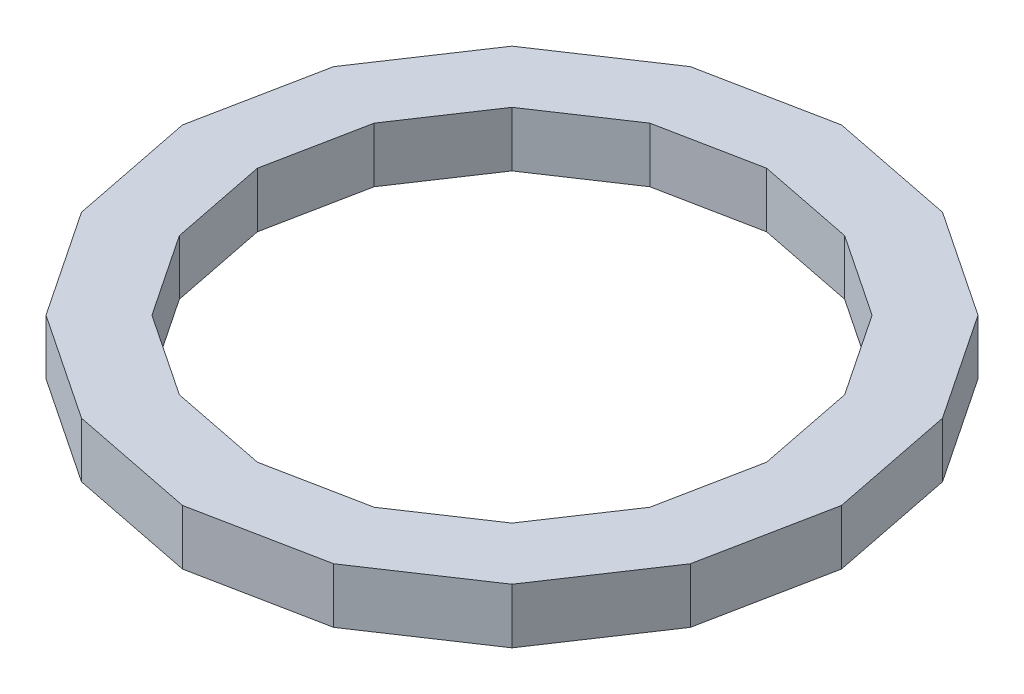
ISO-10303-21;
HEADER;
FILE_DESCRIPTION(('STEP AP214'),'2;1');
FILE_NAME('part.step','',(''),(''),'','','');
FILE_SCHEMA(('AUTOMOTIVE_DESIGN { 1 0 10303 214 1 1 1 1 }'));
ENDSEC;
DATA;
#1=APPLICATION_CONTEXT('core data for automotive mechanical design processes');
#2=APPLICATION_PROTOCOL_DEFINITION('international standard','automotive_design',2000,#1);
#3=PRODUCT_CONTEXT('',#1,'mechanical');
#4=PRODUCT('Part','Part','',(#3));
#5=PRODUCT_RELATED_PRODUCT_CATEGORY('part','',(#4));
#6=PRODUCT_DEFINITION_FORMATION('','',#4);
#7=PRODUCT_DEFINITION_CONTEXT('part definition',#1,'design');
#8=PRODUCT_DEFINITION('design','',#6,#7);
#9=PRODUCT_DEFINITION_SHAPE('','',#8);
#10=(LENGTH_UNIT() NAMED_UNIT(*) SI_UNIT(.MILLI.,.METRE.));
#11=(NAMED_UNIT(*) PLANE_ANGLE_UNIT() SI_UNIT($,.RADIAN.));
#12=(NAMED_UNIT(*) SI_UNIT($,.STERADIAN.) SOLID_ANGLE_UNIT());
#13=UNCERTAINTY_MEASURE_WITH_UNIT(LENGTH_MEASURE(1.E-05),#10,'distance_accuracy_value','');
#14=(GEOMETRIC_REPRESENTATION_CONTEXT(3) GLOBAL_UNCERTAINTY_ASSIGNED_CONTEXT((#13)) GLOBAL_UNIT_ASSIGNED_CONTEXT((#10,
#11,#12)) REPRESENTATION_CONTEXT('',''));
#15=CARTESIAN_POINT('',(0.,0.,0.));
#16=DIRECTION('',(0.,0.,1.));
#17=DIRECTION('',(1.,0.,0.));
#18=AXIS2_PLACEMENT_3D('',#15,#16,#17);
#19=CARTESIAN_POINT('',(0.,19.05,0.));
#20=DIRECTION('',(0.,1.,0.));
#21=DIRECTION('',(0.,0.,1.));
#22=AXIS2_PLACEMENT_3D('',#19,#20,#21);
#23=PLANE('',#22);
#24=DIRECTION('',(0.195090322016118,0.,-0.980785280403232));
#25=VECTOR('',#24,1.);
#26=CARTESIAN_POINT('',(105.249826838494,19.05,43.5959057139226));
#27=LINE('',#26,#25);
#28=CARTESIAN_POINT('',(105.249826838494,19.05,43.5959057139226));
#29=VERTEX_POINT('',#28);
#30=CARTESIAN_POINT('',(113.92159165211,19.05,-1.24901240284257E-12));
#31=VERTEX_POINT('',#30);
#32=EDGE_CURVE('E388',#29,#31,#27,.T.);
#33=ORIENTED_EDGE('',*,*,#32,.T.);
#34=DIRECTION('',(-0.195090322016138,0.,-0.980785280403229));
#35=VECTOR('',#34,1.);
#36=CARTESIAN_POINT('',(113.92159165211,19.05,-1.24901240284257E-12));
#37=LINE('',#36,#35);
#38=CARTESIAN_POINT('',(105.249826838493,19.05,-43.5959057139248));
#39=VERTEX_POINT('',#38);
#40=EDGE_CURVE('E392',#31,#39,#37,.T.);
#41=ORIENTED_EDGE('',*,*,#40,.T.);
#42=DIRECTION('',(-0.555570233019611,0.,-0.831469612302539));
#43=VECTOR('',#42,1.);
#44=CARTESIAN_POINT('',(105.249826838493,19.05,-43.5959057139248));
#45=LINE('',#44,#43);
#46=CARTESIAN_POINT('',(80.554729980771,19.05,-80.5547299807727));
#47=VERTEX_POINT('',#46);
#48=EDGE_CURVE('E396',#39,#47,#45,.T.);
#49=ORIENTED_EDGE('',*,*,#48,.T.);
#50=DIRECTION('',(-0.831469612302551,0.,-0.555570233019594));
#51=VECTOR('',#50,1.);
#52=CARTESIAN_POINT('',(80.554729980771,19.05,-80.5547299807727));
#53=LINE('',#52,#51);
#54=CARTESIAN_POINT('',(43.5959057139226,19.05,-105.249826838494));
#55=VERTEX_POINT('',#54);
#56=EDGE_CURVE('E399',#47,#55,#53,.T.);
#57=ORIENTED_EDGE('',*,*,#56,.T.);
#58=DIRECTION('',(-0.980785280403232,0.,-0.195090322016118));
#59=VECTOR('',#58,1.);
#60=CARTESIAN_POINT('',(43.5959057139226,19.05,-105.249826838494));
#61=LINE('',#60,#59);
#62=CARTESIAN_POINT('',(-1.17309449060085E-12,19.05,-113.92159165211));
#63=VERTEX_POINT('',#62);
#64=EDGE_CURVE('E402',#55,#63,#61,.T.);
#65=ORIENTED_EDGE('',*,*,#64,.T.);
#66=DIRECTION('',(-0.980785280403228,0.,0.195090322016138));
#67=VECTOR('',#66,1.);
#68=CARTESIAN_POINT('',(-1.17309449060085E-12,19.05,-113.92159165211));
#69=LINE('',#68,#67);
#70=CARTESIAN_POINT('',(-43.5959057139247,19.05,-105.249826838493));
#71=VERTEX_POINT('',#70);
#72=EDGE_CURVE('E405',#63,#71,#69,.T.);
#73=ORIENTED_EDGE('',*,*,#72,.T.);
#74=DIRECTION('',(-0.831469612302539,0.,0.555570233019611));
#75=VECTOR('',#74,1.);
#76=CARTESIAN_POINT('',(-43.5959057139247,19.05,-105.249826838493));
#77=LINE('',#76,#75);
#78=CARTESIAN_POINT('',(-80.5547299807727,19.05,-80.554729980771));
#79=VERTEX_POINT('',#78);
#80=EDGE_CURVE('E407',#71,#79,#77,.T.);
#81=ORIENTED_EDGE('',*,*,#80,.T.);
#82=DIRECTION('',(-0.555570233019594,0.,0.831469612302551));
#83=VECTOR('',#82,1.);
#84=CARTESIAN_POINT('',(-80.5547299807727,19.05,-80.554729980771));
#85=LINE('',#84,#83);
#86=CARTESIAN_POINT('',(-105.249826838494,19.05,-43.5959057139225));
#87=VERTEX_POINT('',#86);
#88=EDGE_CURVE('E409',#79,#87,#85,.T.);
#89=ORIENTED_EDGE('',*,*,#88,.T.);
#90=DIRECTION('',(-0.195090322016118,0.,0.980785280403232));
#91=VECTOR('',#90,1.);
#92=CARTESIAN_POINT('',(-105.249826838494,19.05,-43.5959057139225));
#93=LINE('',#92,#91);
#94=CARTESIAN_POINT('',(-113.92159165211,19.05,1.16079507777352E-12));
#95=VERTEX_POINT('',#94);
#96=EDGE_CURVE('E411',#87,#95,#93,.T.);
#97=ORIENTED_EDGE('',*,*,#96,.T.);
#98=DIRECTION('',(0.195090322016138,0.,0.980785280403229));
#99=VECTOR('',#98,1.);
#100=CARTESIAN_POINT('',(-113.92159165211,19.05,1.16079507777352E-12));
#101=LINE('',#100,#99);
#102=CARTESIAN_POINT('',(-105.249826838493,19.05,43.5959057139248));
#103=VERTEX_POINT('',#102);
#104=EDGE_CURVE('E413',#95,#103,#101,.T.);
#105=ORIENTED_EDGE('',*,*,#104,.T.);
#106=DIRECTION('',(0.555570233019611,0.,0.831469612302539));
#107=VECTOR('',#106,1.);
#108=CARTESIAN_POINT('',(-105.249826838493,19.05,43.5959057139248));
#109=LINE('',#108,#107);
#110=CARTESIAN_POINT('',(-80.554729980771,19.05,80.5547299807727));
#111=VERTEX_POINT('',#110);
#112=EDGE_CURVE('E415',#103,#111,#109,.T.);
#113=ORIENTED_EDGE('',*,*,#112,.T.);
#114=DIRECTION('',(0.831469612302551,0.,0.555570233019594));
#115=VECTOR('',#114,1.);
#116=CARTESIAN_POINT('',(-80.554729980771,19.05,80.5547299807727));
#117=LINE('',#116,#115);
#118=CARTESIAN_POINT('',(-43.5959057139226,19.05,105.249826838494));
#119=VERTEX_POINT('',#118);
#120=EDGE_CURVE('E417',#111,#119,#117,.T.);
#121=ORIENTED_EDGE('',*,*,#120,.T.);
#122=DIRECTION('',(0.980785280403232,0.,0.195090322016118));
#123=VECTOR('',#122,1.);
#124=CARTESIAN_POINT('',(-43.5959057139226,19.05,105.249826838494));
#125=LINE('',#124,#123);
#126=CARTESIAN_POINT('',(1.1605251418322E-12,19.05,113.92159165211));
#127=VERTEX_POINT('',#126);
#128=EDGE_CURVE('E419',#119,#127,#125,.T.);
#129=ORIENTED_EDGE('',*,*,#128,.T.);
#130=DIRECTION('',(0.980785280403228,0.,-0.195090322016138));
#131=VECTOR('',#130,1.);
#132=CARTESIAN_POINT('',(1.1605251418322E-12,19.05,113.92159165211));
#133=LINE('',#132,#131);
#134=CARTESIAN_POINT('',(43.5959057139247,19.05,105.249826838493));
#135=VERTEX_POINT('',#134);
#136=EDGE_CURVE('E421',#127,#135,#133,.T.);
#137=ORIENTED_EDGE('',*,*,#136,.T.);
#138=DIRECTION('',(0.83146961230254,0.,-0.555570233019611));
#139=VECTOR('',#138,1.);
#140=CARTESIAN_POINT('',(43.5959057139247,19.05,105.249826838493));
#141=LINE('',#140,#139);
#142=CARTESIAN_POINT('',(80.5547299807726,19.05,80.5547299807711));
#143=VERTEX_POINT('',#142);
#144=EDGE_CURVE('E423',#135,#143,#141,.T.);
#145=ORIENTED_EDGE('',*,*,#144,.T.);
#146=DIRECTION('',(0.555570233019594,0.,-0.831469612302551));
#147=VECTOR('',#146,1.);
#148=CARTESIAN_POINT('',(80.5547299807726,19.05,80.5547299807711));
#149=LINE('',#148,#147);
#150=EDGE_CURVE('E425',#143,#29,#149,.T.);
#151=ORIENTED_EDGE('',*,*,#150,.T.);
#152=EDGE_LOOP('',(#33,#41,#49,#57,#65,#73,#81,#89,#97,#105,#113,#121,#129,#137,#145,#151));
#153=FACE_BOUND('',#152,.T.);
#154=DIRECTION('',(-0.195090322016138,0.,-0.980785280403228));
#155=VECTOR('',#154,1.);
#156=CARTESIAN_POINT('',(88.0239762336188,19.05,-9.2944613535791E-13));
#157=LINE('',#156,#155);
#158=CARTESIAN_POINT('',(88.0239762336188,19.05,-9.2944613535791E-13));
#159=VERTEX_POINT('',#158);
#160=CARTESIAN_POINT('',(81.3235500125,19.05,-33.6853173555052));
#161=VERTEX_POINT('',#160);
#162=EDGE_CURVE('E252',#159,#161,#157,.T.);
#163=ORIENTED_EDGE('',*,*,#162,.F.);
#164=DIRECTION('',(0.195090322016118,0.,-0.980785280403232));
#165=VECTOR('',#164,1.);
#166=CARTESIAN_POINT('',(81.3235500125007,19.05,33.6853173555035));
#167=LINE('',#166,#165);
#168=CARTESIAN_POINT('',(81.3235500125007,19.05,33.6853173555035));
#169=VERTEX_POINT('',#168);
#170=EDGE_CURVE('E244',#169,#159,#167,.T.);
#171=ORIENTED_EDGE('',*,*,#170,.F.);
#172=DIRECTION('',(0.555570233019594,0.,-0.831469612302551));
#173=VECTOR('',#172,1.);
#174=CARTESIAN_POINT('',(62.242350501796,19.05,62.2423505017948));
#175=LINE('',#174,#173);
#176=CARTESIAN_POINT('',(62.242350501796,19.05,62.2423505017948));
#177=VERTEX_POINT('',#176);
#178=EDGE_CURVE('E303',#177,#169,#175,.T.);
#179=ORIENTED_EDGE('',*,*,#178,.F.);
#180=DIRECTION('',(0.831469612302539,0.,-0.555570233019611));
#181=VECTOR('',#180,1.);
#182=CARTESIAN_POINT('',(33.6853173555052,19.05,81.3235500125));
#183=LINE('',#182,#181);
#184=CARTESIAN_POINT('',(33.6853173555052,19.05,81.3235500125));
#185=VERTEX_POINT('',#184);
#186=EDGE_CURVE('E300',#185,#177,#183,.T.);
#187=ORIENTED_EDGE('',*,*,#186,.F.);
#188=DIRECTION('',(0.980785280403228,0.,-0.195090322016138));
#189=VECTOR('',#188,1.);
#190=CARTESIAN_POINT('',(9.15256136326527E-13,19.05,88.0239762336188));
#191=LINE('',#190,#189);
#192=CARTESIAN_POINT('',(9.15256136326527E-13,19.05,88.0239762336188));
#193=VERTEX_POINT('',#192);
#194=EDGE_CURVE('E298',#193,#185,#191,.T.);
#195=ORIENTED_EDGE('',*,*,#194,.F.);
#196=DIRECTION('',(0.980785280403233,0.,0.195090322016118));
#197=VECTOR('',#196,1.);
#198=CARTESIAN_POINT('',(-33.6853173555035,19.05,81.3235500125007));
#199=LINE('',#198,#197);
#200=CARTESIAN_POINT('',(-33.6853173555035,19.05,81.3235500125007));
#201=VERTEX_POINT('',#200);
#202=EDGE_CURVE('E296',#201,#193,#199,.T.);
#203=ORIENTED_EDGE('',*,*,#202,.F.);
#204=DIRECTION('',(0.831469612302551,0.,0.555570233019594));
#205=VECTOR('',#204,1.);
#206=CARTESIAN_POINT('',(-62.2423505017947,19.05,62.242350501796));
#207=LINE('',#206,#205);
#208=CARTESIAN_POINT('',(-62.2423505017947,19.05,62.242350501796));
#209=VERTEX_POINT('',#208);
#210=EDGE_CURVE('E293',#209,#201,#207,.T.);
#211=ORIENTED_EDGE('',*,*,#210,.F.);
#212=DIRECTION('',(0.555570233019611,0.,0.831469612302539));
#213=VECTOR('',#212,1.);
#214=CARTESIAN_POINT('',(-81.3235500125,19.05,33.6853173555052));
#215=LINE('',#214,#213);
#216=CARTESIAN_POINT('',(-81.3235500125,19.05,33.6853173555052));
#217=VERTEX_POINT('',#216);
#218=EDGE_CURVE('E291',#217,#209,#215,.T.);
#219=ORIENTED_EDGE('',*,*,#218,.F.);
#220=DIRECTION('',(0.195090322016138,0.,0.980785280403229));
#221=VECTOR('',#220,1.);
#222=CARTESIAN_POINT('',(-88.0239762336188,19.05,9.29161693846404E-13));
#223=LINE('',#222,#221);
#224=CARTESIAN_POINT('',(-88.0239762336188,19.05,9.29161693846404E-13));
#225=VERTEX_POINT('',#224);
#226=EDGE_CURVE('E289',#225,#217,#223,.T.);
#227=ORIENTED_EDGE('',*,*,#226,.F.);
#228=DIRECTION('',(-0.195090322016118,0.,0.980785280403233));
#229=VECTOR('',#228,1.);
#230=CARTESIAN_POINT('',(-81.3235500125007,19.05,-33.6853173555034));
#231=LINE('',#230,#229);
#232=CARTESIAN_POINT('',(-81.3235500125007,19.05,-33.6853173555034));
#233=VERTEX_POINT('',#232);
#234=EDGE_CURVE('E287',#233,#225,#231,.T.);
#235=ORIENTED_EDGE('',*,*,#234,.F.);
#236=DIRECTION('',(-0.555570233019594,0.,0.831469612302551));
#237=VECTOR('',#236,1.);
#238=CARTESIAN_POINT('',(-62.242350501796,19.05,-62.2423505017947));
#239=LINE('',#238,#237);
#240=CARTESIAN_POINT('',(-62.242350501796,19.05,-62.2423505017947));
#241=VERTEX_POINT('',#240);
#242=EDGE_CURVE('E285',#241,#233,#239,.T.);
#243=ORIENTED_EDGE('',*,*,#242,.F.);
#244=DIRECTION('',(-0.831469612302539,0.,0.555570233019611));
#245=VECTOR('',#244,1.);
#246=CARTESIAN_POINT('',(-33.6853173555052,19.05,-81.3235500125));
#247=LINE('',#246,#245);
#248=CARTESIAN_POINT('',(-33.6853173555052,19.05,-81.3235500125));
#249=VERTEX_POINT('',#248);
#250=EDGE_CURVE('E283',#249,#241,#247,.T.);
#251=ORIENTED_EDGE('',*,*,#250,.F.);
#252=DIRECTION('',(-0.980785280403228,0.,0.195090322016139));
#253=VECTOR('',#252,1.);
#254=CARTESIAN_POINT('',(-9.09489969665209E-13,19.05,-88.0239762336188));
#255=LINE('',#254,#253);
#256=CARTESIAN_POINT('',(-9.09489969665209E-13,19.05,-88.0239762336188));
#257=VERTEX_POINT('',#256);
#258=EDGE_CURVE('E281',#257,#249,#255,.T.);
#259=ORIENTED_EDGE('',*,*,#258,.F.);
#260=DIRECTION('',(-0.980785280403232,0.,-0.195090322016118));
#261=VECTOR('',#260,1.);
#262=CARTESIAN_POINT('',(33.6853173555036,19.05,-81.3235500125007));
#263=LINE('',#262,#261);
#264=CARTESIAN_POINT('',(33.6853173555036,19.05,-81.3235500125007));
#265=VERTEX_POINT('',#264);
#266=EDGE_CURVE('E278',#265,#257,#263,.T.);
#267=ORIENTED_EDGE('',*,*,#266,.F.);
#268=DIRECTION('',(-0.831469612302551,0.,-0.555570233019594));
#269=VECTOR('',#268,1.);
#270=CARTESIAN_POINT('',(62.2423505017947,19.05,-62.242350501796));
#271=LINE('',#270,#269);
#272=CARTESIAN_POINT('',(62.2423505017947,19.05,-62.242350501796));
#273=VERTEX_POINT('',#272);
#274=EDGE_CURVE('E273',#273,#265,#271,.T.);
#275=ORIENTED_EDGE('',*,*,#274,.F.);
#276=DIRECTION('',(-0.555570233019611,0.,-0.831469612302539));
#277=VECTOR('',#276,1.);
#278=CARTESIAN_POINT('',(81.3235500125,19.05,-33.6853173555052));
#279=LINE('',#278,#277);
#280=EDGE_CURVE('E266',#161,#273,#279,.T.);
#281=ORIENTED_EDGE('',*,*,#280,.F.);
#282=EDGE_LOOP('',(#163,#171,#179,#187,#195,#203,#211,#219,#227,#235,#243,#251,#259,#267,#275,#281));
#283=FACE_BOUND('',#282,.T.);
#284=ADVANCED_FACE('F35',(#153,#283),#23,.T.);
#285=CARTESIAN_POINT('',(0.,0.,0.));
#286=DIRECTION('',(0.,1.,0.));
#287=DIRECTION('',(0.,0.,1.));
#288=AXIS2_PLACEMENT_3D('',#285,#286,#287);
#289=PLANE('',#288);
#290=DIRECTION('',(0.195090322016118,0.,-0.980785280403232));
#291=VECTOR('',#290,1.);
#292=CARTESIAN_POINT('',(105.249826838494,0.,43.5959057139226));
#293=LINE('',#292,#291);
#294=CARTESIAN_POINT('',(105.249826838494,0.,43.5959057139226));
#295=VERTEX_POINT('',#294);
#296=CARTESIAN_POINT('',(113.92159165211,0.,-1.24901240284257E-12));
#297=VERTEX_POINT('',#296);
#298=EDGE_CURVE('E261',#295,#297,#293,.T.);
#299=ORIENTED_EDGE('',*,*,#298,.F.);
#300=DIRECTION('',(0.555570233019594,0.,-0.831469612302551));
#301=VECTOR('',#300,1.);
#302=CARTESIAN_POINT('',(80.5547299807726,0.,80.5547299807711));
#303=LINE('',#302,#301);
#304=CARTESIAN_POINT('',(80.5547299807726,0.,80.5547299807711));
#305=VERTEX_POINT('',#304);
#306=EDGE_CURVE('E393',#305,#295,#303,.T.);
#307=ORIENTED_EDGE('',*,*,#306,.F.);
#308=DIRECTION('',(0.83146961230254,0.,-0.555570233019611));
#309=VECTOR('',#308,1.);
#310=CARTESIAN_POINT('',(43.5959057139247,0.,105.249826838493));
#311=LINE('',#310,#309);
#312=CARTESIAN_POINT('',(43.5959057139247,0.,105.249826838493));
#313=VERTEX_POINT('',#312);
#314=EDGE_CURVE('E467',#313,#305,#311,.T.);
#315=ORIENTED_EDGE('',*,*,#314,.F.);
#316=DIRECTION('',(0.980785280403228,0.,-0.195090322016138));
#317=VECTOR('',#316,1.);
#318=CARTESIAN_POINT('',(1.1605251418322E-12,0.,113.92159165211));
#319=LINE('',#318,#317);
#320=CARTESIAN_POINT('',(1.1605251418322E-12,0.,113.92159165211));
#321=VERTEX_POINT('',#320);
#322=EDGE_CURVE('E464',#321,#313,#319,.T.);
#323=ORIENTED_EDGE('',*,*,#322,.F.);
#324=DIRECTION('',(0.980785280403232,0.,0.195090322016118));
#325=VECTOR('',#324,1.);
#326=CARTESIAN_POINT('',(-43.5959057139226,0.,105.249826838494));
#327=LINE('',#326,#325);
#328=CARTESIAN_POINT('',(-43.5959057139226,0.,105.249826838494));
#329=VERTEX_POINT('',#328);
#330=EDGE_CURVE('E461',#329,#321,#327,.T.);
#331=ORIENTED_EDGE('',*,*,#330,.F.);
#332=DIRECTION('',(0.831469612302551,0.,0.555570233019594));
#333=VECTOR('',#332,1.);
#334=CARTESIAN_POINT('',(-80.554729980771,0.,80.5547299807727));
#335=LINE('',#334,#333);
#336=CARTESIAN_POINT('',(-80.554729980771,0.,80.5547299807727));
#337=VERTEX_POINT('',#336);
#338=EDGE_CURVE('E458',#337,#329,#335,.T.);
#339=ORIENTED_EDGE('',*,*,#338,.F.);
#340=DIRECTION('',(0.555570233019611,0.,0.831469612302539));
#341=VECTOR('',#340,1.);
#342=CARTESIAN_POINT('',(-105.249826838493,0.,43.5959057139248));
#343=LINE('',#342,#341);
#344=CARTESIAN_POINT('',(-105.249826838493,0.,43.5959057139248));
#345=VERTEX_POINT('',#344);
#346=EDGE_CURVE('E455',#345,#337,#343,.T.);
#347=ORIENTED_EDGE('',*,*,#346,.F.);
#348=DIRECTION('',(0.195090322016138,0.,0.980785280403229));
#349=VECTOR('',#348,1.);
#350=CARTESIAN_POINT('',(-113.92159165211,0.,1.16079507777352E-12));
#351=LINE('',#350,#349);
#352=CARTESIAN_POINT('',(-113.92159165211,0.,1.16079507777352E-12));
#353=VERTEX_POINT('',#352);
#354=EDGE_CURVE('E453',#353,#345,#351,.T.);
#355=ORIENTED_EDGE('',*,*,#354,.F.);
#356=DIRECTION('',(-0.195090322016118,0.,0.980785280403232));
#357=VECTOR('',#356,1.);
#358=CARTESIAN_POINT('',(-105.249826838494,0.,-43.5959057139225));
#359=LINE('',#358,#357);
#360=CARTESIAN_POINT('',(-105.249826838494,0.,-43.5959057139225));
#361=VERTEX_POINT('',#360);
#362=EDGE_CURVE('E450',#361,#353,#359,.T.);
#363=ORIENTED_EDGE('',*,*,#362,.F.);
#364=DIRECTION('',(-0.555570233019594,0.,0.831469612302551));
#365=VECTOR('',#364,1.);
#366=CARTESIAN_POINT('',(-80.5547299807727,0.,-80.554729980771));
#367=LINE('',#366,#365);
#368=CARTESIAN_POINT('',(-80.5547299807727,0.,-80.554729980771));
#369=VERTEX_POINT('',#368);
#370=EDGE_CURVE('E448',#369,#361,#367,.T.);
#371=ORIENTED_EDGE('',*,*,#370,.F.);
#372=DIRECTION('',(-0.831469612302539,0.,0.555570233019611));
#373=VECTOR('',#372,1.);
#374=CARTESIAN_POINT('',(-43.5959057139247,0.,-105.249826838493));
#375=LINE('',#374,#373);
#376=CARTESIAN_POINT('',(-43.5959057139247,0.,-105.249826838493));
#377=VERTEX_POINT('',#376);
#378=EDGE_CURVE('E446',#377,#369,#375,.T.);
#379=ORIENTED_EDGE('',*,*,#378,.F.);
#380=DIRECTION('',(-0.980785280403228,0.,0.195090322016138));
#381=VECTOR('',#380,1.);
#382=CARTESIAN_POINT('',(-1.17309449060085E-12,0.,-113.92159165211));
#383=LINE('',#382,#381);
#384=CARTESIAN_POINT('',(-1.17309449060085E-12,0.,-113.92159165211));
#385=VERTEX_POINT('',#384);
#386=EDGE_CURVE('E444',#385,#377,#383,.T.);
#387=ORIENTED_EDGE('',*,*,#386,.F.);
#388=DIRECTION('',(-0.980785280403232,0.,-0.195090322016118));
#389=VECTOR('',#388,1.);
#390=CARTESIAN_POINT('',(43.5959057139226,0.,-105.249826838494));
#391=LINE('',#390,#389);
#392=CARTESIAN_POINT('',(43.5959057139226,0.,-105.249826838494));
#393=VERTEX_POINT('',#392);
#394=EDGE_CURVE('E441',#393,#385,#391,.T.);
#395=ORIENTED_EDGE('',*,*,#394,.F.);
#396=DIRECTION('',(-0.831469612302551,0.,-0.555570233019594));
#397=VECTOR('',#396,1.);
#398=CARTESIAN_POINT('',(80.554729980771,0.,-80.5547299807727));
#399=LINE('',#398,#397);
#400=CARTESIAN_POINT('',(80.554729980771,0.,-80.5547299807727));
#401=VERTEX_POINT('',#400);
#402=EDGE_CURVE('E438',#401,#393,#399,.T.);
#403=ORIENTED_EDGE('',*,*,#402,.F.);
#404=DIRECTION('',(-0.555570233019611,0.,-0.831469612302539));
#405=VECTOR('',#404,1.);
#406=CARTESIAN_POINT('',(105.249826838493,0.,-43.5959057139248));
#407=LINE('',#406,#405);
#408=CARTESIAN_POINT('',(105.249826838493,0.,-43.5959057139248));
#409=VERTEX_POINT('',#408);
#410=EDGE_CURVE('E435',#409,#401,#407,.T.);
#411=ORIENTED_EDGE('',*,*,#410,.F.);
#412=DIRECTION('',(-0.195090322016138,0.,-0.980785280403229));
#413=VECTOR('',#412,1.);
#414=CARTESIAN_POINT('',(113.92159165211,0.,-1.24901240284257E-12));
#415=LINE('',#414,#413);
#416=EDGE_CURVE('E432',#297,#409,#415,.T.);
#417=ORIENTED_EDGE('',*,*,#416,.F.);
#418=EDGE_LOOP('',(#299,#307,#315,#323,#331,#339,#347,#355,#363,#371,#379,#387,#395,#403,#411,#417));
#419=FACE_BOUND('',#418,.T.);
#420=DIRECTION('',(0.195090322016118,0.,-0.980785280403232));
#421=VECTOR('',#420,1.);
#422=CARTESIAN_POINT('',(81.3235500125007,0.,33.6853173555035));
#423=LINE('',#422,#421);
#424=CARTESIAN_POINT('',(81.3235500125007,0.,33.6853173555035));
#425=VERTEX_POINT('',#424);
#426=CARTESIAN_POINT('',(88.0239762336188,0.,-9.2944613535791E-13));
#427=VERTEX_POINT('',#426);
#428=EDGE_CURVE('E58',#425,#427,#423,.T.);
#429=ORIENTED_EDGE('',*,*,#428,.T.);
#430=DIRECTION('',(-0.195090322016138,0.,-0.980785280403228));
#431=VECTOR('',#430,1.);
#432=CARTESIAN_POINT('',(88.0239762336188,0.,-9.2944613535791E-13));
#433=LINE('',#432,#431);
#434=CARTESIAN_POINT('',(81.3235500125,0.,-33.6853173555052));
#435=VERTEX_POINT('',#434);
#436=EDGE_CURVE('E259',#427,#435,#433,.T.);
#437=ORIENTED_EDGE('',*,*,#436,.T.);
#438=DIRECTION('',(-0.555570233019611,0.,-0.831469612302539));
#439=VECTOR('',#438,1.);
#440=CARTESIAN_POINT('',(81.3235500125,0.,-33.6853173555052));
#441=LINE('',#440,#439);
#442=CARTESIAN_POINT('',(62.2423505017947,0.,-62.242350501796));
#443=VERTEX_POINT('',#442);
#444=EDGE_CURVE('E310',#435,#443,#441,.T.);
#445=ORIENTED_EDGE('',*,*,#444,.T.);
#446=DIRECTION('',(-0.831469612302551,0.,-0.555570233019594));
#447=VECTOR('',#446,1.);
#448=CARTESIAN_POINT('',(62.2423505017947,0.,-62.242350501796));
#449=LINE('',#448,#447);
#450=CARTESIAN_POINT('',(33.6853173555036,0.,-81.3235500125007));
#451=VERTEX_POINT('',#450);
#452=EDGE_CURVE('E314',#443,#451,#449,.T.);
#453=ORIENTED_EDGE('',*,*,#452,.T.);
#454=DIRECTION('',(-0.980785280403232,0.,-0.195090322016118));
#455=VECTOR('',#454,1.);
#456=CARTESIAN_POINT('',(33.6853173555036,0.,-81.3235500125007));
#457=LINE('',#456,#455);
#458=CARTESIAN_POINT('',(-9.09489969665209E-13,0.,-88.0239762336188));
#459=VERTEX_POINT('',#458);
#460=EDGE_CURVE('E318',#451,#459,#457,.T.);
#461=ORIENTED_EDGE('',*,*,#460,.T.);
#462=DIRECTION('',(-0.980785280403228,0.,0.195090322016139));
#463=VECTOR('',#462,1.);
#464=CARTESIAN_POINT('',(-9.09489969665209E-13,0.,-88.0239762336188));
#465=LINE('',#464,#463);
#466=CARTESIAN_POINT('',(-33.6853173555052,0.,-81.3235500125));
#467=VERTEX_POINT('',#466);
#468=EDGE_CURVE('E322',#459,#467,#465,.T.);
#469=ORIENTED_EDGE('',*,*,#468,.T.);
#470=DIRECTION('',(-0.831469612302539,0.,0.555570233019611));
#471=VECTOR('',#470,1.);
#472=CARTESIAN_POINT('',(-33.6853173555052,0.,-81.3235500125));
#473=LINE('',#472,#471);
#474=CARTESIAN_POINT('',(-62.242350501796,0.,-62.2423505017947));
#475=VERTEX_POINT('',#474);
#476=EDGE_CURVE('E326',#467,#475,#473,.T.);
#477=ORIENTED_EDGE('',*,*,#476,.T.);
#478=DIRECTION('',(-0.555570233019594,0.,0.831469612302551));
#479=VECTOR('',#478,1.);
#480=CARTESIAN_POINT('',(-62.242350501796,0.,-62.2423505017947));
#481=LINE('',#480,#479);
#482=CARTESIAN_POINT('',(-81.3235500125007,0.,-33.6853173555034));
#483=VERTEX_POINT('',#482);
#484=EDGE_CURVE('E330',#475,#483,#481,.T.);
#485=ORIENTED_EDGE('',*,*,#484,.T.);
#486=DIRECTION('',(-0.195090322016118,0.,0.980785280403233));
#487=VECTOR('',#486,1.);
#488=CARTESIAN_POINT('',(-81.3235500125007,0.,-33.6853173555034));
#489=LINE('',#488,#487);
#490=CARTESIAN_POINT('',(-88.0239762336188,0.,9.29161693846404E-13));
#491=VERTEX_POINT('',#490);
#492=EDGE_CURVE('E333',#483,#491,#489,.T.);
#493=ORIENTED_EDGE('',*,*,#492,.T.);
#494=DIRECTION('',(0.195090322016138,0.,0.980785280403229));
#495=VECTOR('',#494,1.);
#496=CARTESIAN_POINT('',(-88.0239762336188,0.,9.29161693846404E-13));
#497=LINE('',#496,#495);
#498=CARTESIAN_POINT('',(-81.3235500125,0.,33.6853173555052));
#499=VERTEX_POINT('',#498);
#500=EDGE_CURVE('E337',#491,#499,#497,.T.);
#501=ORIENTED_EDGE('',*,*,#500,.T.);
#502=DIRECTION('',(0.555570233019611,0.,0.831469612302539));
#503=VECTOR('',#502,1.);
#504=CARTESIAN_POINT('',(-81.3235500125,0.,33.6853173555052));
#505=LINE('',#504,#503);
#506=CARTESIAN_POINT('',(-62.2423505017947,0.,62.242350501796));
#507=VERTEX_POINT('',#506);
#508=EDGE_CURVE('E340',#499,#507,#505,.T.);
#509=ORIENTED_EDGE('',*,*,#508,.T.);
#510=DIRECTION('',(0.831469612302551,0.,0.555570233019594));
#511=VECTOR('',#510,1.);
#512=CARTESIAN_POINT('',(-62.2423505017947,0.,62.242350501796));
#513=LINE('',#512,#511);
#514=CARTESIAN_POINT('',(-33.6853173555035,0.,81.3235500125007));
#515=VERTEX_POINT('',#514);
#516=EDGE_CURVE('E344',#507,#515,#513,.T.);
#517=ORIENTED_EDGE('',*,*,#516,.T.);
#518=DIRECTION('',(0.980785280403233,0.,0.195090322016118));
#519=VECTOR('',#518,1.);
#520=CARTESIAN_POINT('',(-33.6853173555035,0.,81.3235500125007));
#521=LINE('',#520,#519);
#522=CARTESIAN_POINT('',(9.15256136326527E-13,0.,88.0239762336188));
#523=VERTEX_POINT('',#522);
#524=EDGE_CURVE('E347',#515,#523,#521,.T.);
#525=ORIENTED_EDGE('',*,*,#524,.T.);
#526=DIRECTION('',(0.980785280403228,0.,-0.195090322016138));
#527=VECTOR('',#526,1.);
#528=CARTESIAN_POINT('',(9.15256136326527E-13,0.,88.0239762336188));
#529=LINE('',#528,#527);
#530=CARTESIAN_POINT('',(33.6853173555052,0.,81.3235500125));
#531=VERTEX_POINT('',#530);
#532=EDGE_CURVE('E350',#523,#531,#529,.T.);
#533=ORIENTED_EDGE('',*,*,#532,.T.);
#534=DIRECTION('',(0.831469612302539,0.,-0.555570233019611));
#535=VECTOR('',#534,1.);
#536=CARTESIAN_POINT('',(33.6853173555052,0.,81.3235500125));
#537=LINE('',#536,#535);
#538=CARTESIAN_POINT('',(62.242350501796,0.,62.2423505017948));
#539=VERTEX_POINT('',#538);
#540=EDGE_CURVE('E353',#531,#539,#537,.T.);
#541=ORIENTED_EDGE('',*,*,#540,.T.);
#542=DIRECTION('',(0.555570233019594,0.,-0.831469612302551));
#543=VECTOR('',#542,1.);
#544=CARTESIAN_POINT('',(62.242350501796,0.,62.2423505017948));
#545=LINE('',#544,#543);
#546=EDGE_CURVE('E253',#539,#425,#545,.T.);
#547=ORIENTED_EDGE('',*,*,#546,.T.);
#548=EDGE_LOOP('',(#429,#437,#445,#453,#461,#469,#477,#485,#493,#501,#509,#517,#525,#533,#541,#547));
#549=FACE_BOUND('',#548,.T.);
#550=ADVANCED_FACE('F529',(#419,#549),#289,.F.);
#551=CARTESIAN_POINT('',(105.249826838494,19.05,43.5959057139226));
#552=DIRECTION('',(-0.980785280403232,0.,-0.195090322016118));
#553=DIRECTION('',(-0.195090322016118,0.,0.980785280403233));
#554=AXIS2_PLACEMENT_3D('',#551,#552,#553);
#555=PLANE('',#554);
#556=ORIENTED_EDGE('',*,*,#298,.T.);
#557=DIRECTION('',(0.,-1.,0.));
#558=VECTOR('',#557,1.);
#559=CARTESIAN_POINT('',(113.92159165211,19.05,-1.24901240284257E-12));
#560=LINE('',#559,#558);
#561=EDGE_CURVE('E11',#31,#297,#560,.T.);
#562=ORIENTED_EDGE('',*,*,#561,.F.);
#563=ORIENTED_EDGE('',*,*,#32,.F.);
#564=DIRECTION('',(0.,-1.,0.));
#565=VECTOR('',#564,1.);
#566=CARTESIAN_POINT('',(105.249826838494,19.05,43.5959057139226));
#567=LINE('',#566,#565);
#568=EDGE_CURVE('E428',#29,#295,#567,.T.);
#569=ORIENTED_EDGE('',*,*,#568,.T.);
#570=EDGE_LOOP('',(#556,#562,#563,#569));
#571=FACE_BOUND('',#570,.T.);
#572=ADVANCED_FACE('F37',(#571),#555,.F.);
#573=CARTESIAN_POINT('',(113.92159165211,19.05,-1.24901240284257E-12));
#574=DIRECTION('',(-0.980785280403229,0.,0.195090322016138));
#575=DIRECTION('',(0.195090322016138,0.,0.980785280403229));
#576=AXIS2_PLACEMENT_3D('',#573,#574,#575);
#577=PLANE('',#576);
#578=ORIENTED_EDGE('',*,*,#416,.T.);
#579=DIRECTION('',(0.,-1.,0.));
#580=VECTOR('',#579,1.);
#581=CARTESIAN_POINT('',(105.249826838493,19.05,-43.5959057139248));
#582=LINE('',#581,#580);
#583=EDGE_CURVE('E43',#39,#409,#582,.T.);
#584=ORIENTED_EDGE('',*,*,#583,.F.);
#585=ORIENTED_EDGE('',*,*,#40,.F.);
#586=ORIENTED_EDGE('',*,*,#561,.T.);
#587=EDGE_LOOP('',(#578,#584,#585,#586));
#588=FACE_BOUND('',#587,.T.);
#589=ADVANCED_FACE('F546',(#588),#577,.F.);
#590=CARTESIAN_POINT('',(105.249826838493,19.05,-43.5959057139248));
#591=DIRECTION('',(-0.831469612302539,0.,0.555570233019611));
#592=DIRECTION('',(0.555570233019611,0.,0.831469612302539));
#593=AXIS2_PLACEMENT_3D('',#590,#591,#592);
#594=PLANE('',#593);
#595=ORIENTED_EDGE('',*,*,#410,.T.);
#596=DIRECTION('',(0.,-1.,0.));
#597=VECTOR('',#596,1.);
#598=CARTESIAN_POINT('',(80.554729980771,19.05,-80.5547299807727));
#599=LINE('',#598,#597);
#600=EDGE_CURVE('E512',#47,#401,#599,.T.);
#601=ORIENTED_EDGE('',*,*,#600,.F.);
#602=ORIENTED_EDGE('',*,*,#48,.F.);
#603=ORIENTED_EDGE('',*,*,#583,.T.);
#604=EDGE_LOOP('',(#595,#601,#602,#603));
#605=FACE_BOUND('',#604,.T.);
#606=ADVANCED_FACE('F523',(#605),#594,.F.);
#607=CARTESIAN_POINT('',(80.554729980771,19.05,-80.5547299807727));
#608=DIRECTION('',(-0.555570233019594,0.,0.831469612302551));
#609=DIRECTION('',(0.831469612302551,0.,0.555570233019594));
#610=AXIS2_PLACEMENT_3D('',#607,#608,#609);
#611=PLANE('',#610);
#612=ORIENTED_EDGE('',*,*,#402,.T.);
#613=DIRECTION('',(0.,-1.,0.));
#614=VECTOR('',#613,1.);
#615=CARTESIAN_POINT('',(43.5959057139226,19.05,-105.249826838494));
#616=LINE('',#615,#614);
#617=EDGE_CURVE('E508',#55,#393,#616,.T.);
#618=ORIENTED_EDGE('',*,*,#617,.F.);
#619=ORIENTED_EDGE('',*,*,#56,.F.);
#620=ORIENTED_EDGE('',*,*,#600,.T.);
#621=EDGE_LOOP('',(#612,#618,#619,#620));
#622=FACE_BOUND('',#621,.T.);
#623=ADVANCED_FACE('F535',(#622),#611,.F.);
#624=CARTESIAN_POINT('',(43.5959057139226,19.05,-105.249826838494));
#625=DIRECTION('',(-0.195090322016118,0.,0.980785280403233));
#626=DIRECTION('',(0.980785280403233,0.,0.195090322016118));
#627=AXIS2_PLACEMENT_3D('',#624,#625,#626);
#628=PLANE('',#627);
#629=ORIENTED_EDGE('',*,*,#394,.T.);
#630=DIRECTION('',(0.,-1.,0.));
#631=VECTOR('',#630,1.);
#632=CARTESIAN_POINT('',(-1.17309449060085E-12,19.05,-113.92159165211));
#633=LINE('',#632,#631);
#634=EDGE_CURVE('E505',#63,#385,#633,.T.);
#635=ORIENTED_EDGE('',*,*,#634,.F.);
#636=ORIENTED_EDGE('',*,*,#64,.F.);
#637=ORIENTED_EDGE('',*,*,#617,.T.);
#638=EDGE_LOOP('',(#629,#635,#636,#637));
#639=FACE_BOUND('',#638,.T.);
#640=ADVANCED_FACE('F539',(#639),#628,.F.);
#641=CARTESIAN_POINT('',(-1.17309449060085E-12,19.05,-113.92159165211));
#642=DIRECTION('',(0.195090322016138,0.,0.980785280403228));
#643=DIRECTION('',(0.980785280403229,0.,-0.195090322016138));
#644=AXIS2_PLACEMENT_3D('',#641,#642,#643);
#645=PLANE('',#644);
#646=ORIENTED_EDGE('',*,*,#386,.T.);
#647=DIRECTION('',(0.,-1.,0.));
#648=VECTOR('',#647,1.);
#649=CARTESIAN_POINT('',(-43.5959057139247,19.05,-105.249826838493));
#650=LINE('',#649,#648);
#651=EDGE_CURVE('E502',#71,#377,#650,.T.);
#652=ORIENTED_EDGE('',*,*,#651,.F.);
#653=ORIENTED_EDGE('',*,*,#72,.F.);
#654=ORIENTED_EDGE('',*,*,#634,.T.);
#655=EDGE_LOOP('',(#646,#652,#653,#654));
#656=FACE_BOUND('',#655,.T.);
#657=ADVANCED_FACE('F599',(#656),#645,.F.);
#658=CARTESIAN_POINT('',(-43.5959057139247,19.05,-105.249826838493));
#659=DIRECTION('',(0.555570233019611,0.,0.831469612302539));
#660=DIRECTION('',(0.831469612302539,0.,-0.555570233019611));
#661=AXIS2_PLACEMENT_3D('',#658,#659,#660);
#662=PLANE('',#661);
#663=ORIENTED_EDGE('',*,*,#378,.T.);
#664=DIRECTION('',(0.,-1.,0.));
#665=VECTOR('',#664,1.);
#666=CARTESIAN_POINT('',(-80.5547299807727,19.05,-80.554729980771));
#667=LINE('',#666,#665);
#668=EDGE_CURVE('E499',#79,#369,#667,.T.);
#669=ORIENTED_EDGE('',*,*,#668,.F.);
#670=ORIENTED_EDGE('',*,*,#80,.F.);
#671=ORIENTED_EDGE('',*,*,#651,.T.);
#672=EDGE_LOOP('',(#663,#669,#670,#671));
#673=FACE_BOUND('',#672,.T.);
#674=ADVANCED_FACE('F596',(#673),#662,.F.);
#675=CARTESIAN_POINT('',(-80.5547299807727,19.05,-80.554729980771));
#676=DIRECTION('',(0.831469612302551,0.,0.555570233019594));
#677=DIRECTION('',(0.555570233019594,0.,-0.831469612302551));
#678=AXIS2_PLACEMENT_3D('',#675,#676,#677);
#679=PLANE('',#678);
#680=ORIENTED_EDGE('',*,*,#370,.T.);
#681=DIRECTION('',(0.,-1.,0.));
#682=VECTOR('',#681,1.);
#683=CARTESIAN_POINT('',(-105.249826838494,19.05,-43.5959057139225));
#684=LINE('',#683,#682);
#685=EDGE_CURVE('E496',#87,#361,#684,.T.);
#686=ORIENTED_EDGE('',*,*,#685,.F.);
#687=ORIENTED_EDGE('',*,*,#88,.F.);
#688=ORIENTED_EDGE('',*,*,#668,.T.);
#689=EDGE_LOOP('',(#680,#686,#687,#688));
#690=FACE_BOUND('',#689,.T.);
#691=ADVANCED_FACE('F592',(#690),#679,.F.);
#692=CARTESIAN_POINT('',(-105.249826838494,19.05,-43.5959057139225));
#693=DIRECTION('',(0.980785280403232,0.,0.195090322016118));
#694=DIRECTION('',(0.195090322016118,0.,-0.980785280403233));
#695=AXIS2_PLACEMENT_3D('',#692,#693,#694);
#696=PLANE('',#695);
#697=ORIENTED_EDGE('',*,*,#362,.T.);
#698=DIRECTION('',(0.,-1.,0.));
#699=VECTOR('',#698,1.);
#700=CARTESIAN_POINT('',(-113.92159165211,19.05,1.16079507777352E-12));
#701=LINE('',#700,#699);
#702=EDGE_CURVE('E493',#95,#353,#701,.T.);
#703=ORIENTED_EDGE('',*,*,#702,.F.);
#704=ORIENTED_EDGE('',*,*,#96,.F.);
#705=ORIENTED_EDGE('',*,*,#685,.T.);
#706=EDGE_LOOP('',(#697,#703,#704,#705));
#707=FACE_BOUND('',#706,.T.);
#708=ADVANCED_FACE('F588',(#707),#696,.F.);
#709=CARTESIAN_POINT('',(-113.92159165211,19.05,1.16079507777352E-12));
#710=DIRECTION('',(0.980785280403228,0.,-0.195090322016138));
#711=DIRECTION('',(-0.195090322016138,0.,-0.980785280403229));
#712=AXIS2_PLACEMENT_3D('',#709,#710,#711);
#713=PLANE('',#712);
#714=ORIENTED_EDGE('',*,*,#354,.T.);
#715=DIRECTION('',(0.,-1.,0.));
#716=VECTOR('',#715,1.);
#717=CARTESIAN_POINT('',(-105.249826838493,19.05,43.5959057139248));
#718=LINE('',#717,#716);
#719=EDGE_CURVE('E490',#103,#345,#718,.T.);
#720=ORIENTED_EDGE('',*,*,#719,.F.);
#721=ORIENTED_EDGE('',*,*,#104,.F.);
#722=ORIENTED_EDGE('',*,*,#702,.T.);
#723=EDGE_LOOP('',(#714,#720,#721,#722));
#724=FACE_BOUND('',#723,.T.);
#725=ADVANCED_FACE('F583',(#724),#713,.F.);
#726=CARTESIAN_POINT('',(-105.249826838493,19.05,43.5959057139248));
#727=DIRECTION('',(0.831469612302539,0.,-0.555570233019611));
#728=DIRECTION('',(-0.555570233019611,0.,-0.831469612302539));
#729=AXIS2_PLACEMENT_3D('',#726,#727,#728);
#730=PLANE('',#729);
#731=ORIENTED_EDGE('',*,*,#346,.T.);
#732=DIRECTION('',(0.,-1.,0.));
#733=VECTOR('',#732,1.);
#734=CARTESIAN_POINT('',(-80.554729980771,19.05,80.5547299807727));
#735=LINE('',#734,#733);
#736=EDGE_CURVE('E486',#111,#337,#735,.T.);
#737=ORIENTED_EDGE('',*,*,#736,.F.);
#738=ORIENTED_EDGE('',*,*,#112,.F.);
#739=ORIENTED_EDGE('',*,*,#719,.T.);
#740=EDGE_LOOP('',(#731,#737,#738,#739));
#741=FACE_BOUND('',#740,.T.);
#742=ADVANCED_FACE('F577',(#741),#730,.F.);
#743=CARTESIAN_POINT('',(-80.554729980771,19.05,80.5547299807727));
#744=DIRECTION('',(0.555570233019594,0.,-0.831469612302551));
#745=DIRECTION('',(-0.831469612302551,0.,-0.555570233019594));
#746=AXIS2_PLACEMENT_3D('',#743,#744,#745);
#747=PLANE('',#746);
#748=ORIENTED_EDGE('',*,*,#338,.T.);
#749=DIRECTION('',(0.,-1.,0.));
#750=VECTOR('',#749,1.);
#751=CARTESIAN_POINT('',(-43.5959057139226,19.05,105.249826838494));
#752=LINE('',#751,#750);
#753=EDGE_CURVE('E482',#119,#329,#752,.T.);
#754=ORIENTED_EDGE('',*,*,#753,.F.);
#755=ORIENTED_EDGE('',*,*,#120,.F.);
#756=ORIENTED_EDGE('',*,*,#736,.T.);
#757=EDGE_LOOP('',(#748,#754,#755,#756));
#758=FACE_BOUND('',#757,.T.);
#759=ADVANCED_FACE('F573',(#758),#747,.F.);
#760=CARTESIAN_POINT('',(-43.5959057139226,19.05,105.249826838494));
#761=DIRECTION('',(0.195090322016118,0.,-0.980785280403232));
#762=DIRECTION('',(-0.980785280403232,0.,-0.195090322016118));
#763=AXIS2_PLACEMENT_3D('',#760,#761,#762);
#764=PLANE('',#763);
#765=ORIENTED_EDGE('',*,*,#330,.T.);
#766=DIRECTION('',(0.,-1.,0.));
#767=VECTOR('',#766,1.);
#768=CARTESIAN_POINT('',(1.1605251418322E-12,19.05,113.92159165211));
#769=LINE('',#768,#767);
#770=EDGE_CURVE('E479',#127,#321,#769,.T.);
#771=ORIENTED_EDGE('',*,*,#770,.F.);
#772=ORIENTED_EDGE('',*,*,#128,.F.);
#773=ORIENTED_EDGE('',*,*,#753,.T.);
#774=EDGE_LOOP('',(#765,#771,#772,#773));
#775=FACE_BOUND('',#774,.T.);
#776=ADVANCED_FACE('F568',(#775),#764,.F.);
#777=CARTESIAN_POINT('',(1.1605251418322E-12,19.05,113.92159165211));
#778=DIRECTION('',(-0.195090322016138,0.,-0.980785280403228));
#779=DIRECTION('',(-0.980785280403229,0.,0.195090322016139));
#780=AXIS2_PLACEMENT_3D('',#777,#778,#779);
#781=PLANE('',#780);
#782=ORIENTED_EDGE('',*,*,#322,.T.);
#783=DIRECTION('',(0.,-1.,0.));
#784=VECTOR('',#783,1.);
#785=CARTESIAN_POINT('',(43.5959057139247,19.05,105.249826838493));
#786=LINE('',#785,#784);
#787=EDGE_CURVE('E476',#135,#313,#786,.T.);
#788=ORIENTED_EDGE('',*,*,#787,.F.);
#789=ORIENTED_EDGE('',*,*,#136,.F.);
#790=ORIENTED_EDGE('',*,*,#770,.T.);
#791=EDGE_LOOP('',(#782,#788,#789,#790));
#792=FACE_BOUND('',#791,.T.);
#793=ADVANCED_FACE('F562',(#792),#781,.F.);
#794=CARTESIAN_POINT('',(43.5959057139247,19.05,105.249826838493));
#795=DIRECTION('',(-0.555570233019611,0.,-0.83146961230254));
#796=DIRECTION('',(-0.83146961230254,0.,0.555570233019611));
#797=AXIS2_PLACEMENT_3D('',#794,#795,#796);
#798=PLANE('',#797);
#799=ORIENTED_EDGE('',*,*,#314,.T.);
#800=DIRECTION('',(0.,-1.,0.));
#801=VECTOR('',#800,1.);
#802=CARTESIAN_POINT('',(80.5547299807726,19.05,80.5547299807711));
#803=LINE('',#802,#801);
#804=EDGE_CURVE('E473',#143,#305,#803,.T.);
#805=ORIENTED_EDGE('',*,*,#804,.F.);
#806=ORIENTED_EDGE('',*,*,#144,.F.);
#807=ORIENTED_EDGE('',*,*,#787,.T.);
#808=EDGE_LOOP('',(#799,#805,#806,#807));
#809=FACE_BOUND('',#808,.T.);
#810=ADVANCED_FACE('F558',(#809),#798,.F.);
#811=CARTESIAN_POINT('',(80.5547299807726,19.05,80.5547299807711));
#812=DIRECTION('',(-0.831469612302551,0.,-0.555570233019594));
#813=DIRECTION('',(-0.555570233019594,0.,0.831469612302551));
#814=AXIS2_PLACEMENT_3D('',#811,#812,#813);
#815=PLANE('',#814);
#816=ORIENTED_EDGE('',*,*,#306,.T.);
#817=ORIENTED_EDGE('',*,*,#568,.F.);
#818=ORIENTED_EDGE('',*,*,#150,.F.);
#819=ORIENTED_EDGE('',*,*,#804,.T.);
#820=EDGE_LOOP('',(#816,#817,#818,#819));
#821=FACE_BOUND('',#820,.T.);
#822=ADVANCED_FACE('F553',(#821),#815,.F.);
#823=CARTESIAN_POINT('',(81.3235500125007,19.05,33.6853173555035));
#824=DIRECTION('',(-0.980785280403233,0.,-0.195090322016118));
#825=DIRECTION('',(-0.195090322016118,0.,0.980785280403233));
#826=AXIS2_PLACEMENT_3D('',#823,#824,#825);
#827=PLANE('',#826);
#828=ORIENTED_EDGE('',*,*,#428,.F.);
#829=DIRECTION('',(0.,-1.,0.));
#830=VECTOR('',#829,1.);
#831=CARTESIAN_POINT('',(81.3235500125007,19.05,33.6853173555035));
#832=LINE('',#831,#830);
#833=EDGE_CURVE('E248',#169,#425,#832,.T.);
#834=ORIENTED_EDGE('',*,*,#833,.F.);
#835=ORIENTED_EDGE('',*,*,#170,.T.);
#836=DIRECTION('',(0.,-1.,0.));
#837=VECTOR('',#836,1.);
#838=CARTESIAN_POINT('',(88.0239762336188,19.05,-9.2944613535791E-13));
#839=LINE('',#838,#837);
#840=EDGE_CURVE('E247',#159,#427,#839,.T.);
#841=ORIENTED_EDGE('',*,*,#840,.T.);
#842=EDGE_LOOP('',(#828,#834,#835,#841));
#843=FACE_BOUND('',#842,.T.);
#844=ADVANCED_FACE('F246',(#843),#827,.T.);
#845=CARTESIAN_POINT('',(88.0239762336188,19.05,-9.2944613535791E-13));
#846=DIRECTION('',(-0.980785280403228,0.,0.195090322016138));
#847=DIRECTION('',(0.195090322016138,0.,0.980785280403229));
#848=AXIS2_PLACEMENT_3D('',#845,#846,#847);
#849=PLANE('',#848);
#850=ORIENTED_EDGE('',*,*,#436,.F.);
#851=ORIENTED_EDGE('',*,*,#840,.F.);
#852=ORIENTED_EDGE('',*,*,#162,.T.);
#853=DIRECTION('',(0.,-1.,0.));
#854=VECTOR('',#853,1.);
#855=CARTESIAN_POINT('',(81.3235500125,19.05,-33.6853173555052));
#856=LINE('',#855,#854);
#857=EDGE_CURVE('E262',#161,#435,#856,.T.);
#858=ORIENTED_EDGE('',*,*,#857,.T.);
#859=EDGE_LOOP('',(#850,#851,#852,#858));
#860=FACE_BOUND('',#859,.T.);
#861=ADVANCED_FACE('F256',(#860),#849,.T.);
#862=CARTESIAN_POINT('',(81.3235500125,19.05,-33.6853173555052));
#863=DIRECTION('',(-0.831469612302539,0.,0.555570233019611));
#864=DIRECTION('',(0.555570233019611,0.,0.831469612302539));
#865=AXIS2_PLACEMENT_3D('',#862,#863,#864);
#866=PLANE('',#865);
#867=ORIENTED_EDGE('',*,*,#444,.F.);
#868=ORIENTED_EDGE('',*,*,#857,.F.);
#869=ORIENTED_EDGE('',*,*,#280,.T.);
#870=DIRECTION('',(0.,-1.,0.));
#871=VECTOR('',#870,1.);
#872=CARTESIAN_POINT('',(62.2423505017947,19.05,-62.242350501796));
#873=LINE('',#872,#871);
#874=EDGE_CURVE('E384',#273,#443,#873,.T.);
#875=ORIENTED_EDGE('',*,*,#874,.T.);
#876=EDGE_LOOP('',(#867,#868,#869,#875));
#877=FACE_BOUND('',#876,.T.);
#878=ADVANCED_FACE('F681',(#877),#866,.T.);
#879=CARTESIAN_POINT('',(62.2423505017947,19.05,-62.242350501796));
#880=DIRECTION('',(-0.555570233019594,0.,0.831469612302551));
#881=DIRECTION('',(0.831469612302551,0.,0.555570233019594));
#882=AXIS2_PLACEMENT_3D('',#879,#880,#881);
#883=PLANE('',#882);
#884=ORIENTED_EDGE('',*,*,#452,.F.);
#885=ORIENTED_EDGE('',*,*,#874,.F.);
#886=ORIENTED_EDGE('',*,*,#274,.T.);
#887=DIRECTION('',(0.,-1.,0.));
#888=VECTOR('',#887,1.);
#889=CARTESIAN_POINT('',(33.6853173555036,19.05,-81.3235500125007));
#890=LINE('',#889,#888);
#891=EDGE_CURVE('E382',#265,#451,#890,.T.);
#892=ORIENTED_EDGE('',*,*,#891,.T.);
#893=EDGE_LOOP('',(#884,#885,#886,#892));
#894=FACE_BOUND('',#893,.T.);
#895=ADVANCED_FACE('F687',(#894),#883,.T.);
#896=CARTESIAN_POINT('',(33.6853173555036,19.05,-81.3235500125007));
#897=DIRECTION('',(-0.195090322016118,0.,0.980785280403233));
#898=DIRECTION('',(0.980785280403233,0.,0.195090322016118));
#899=AXIS2_PLACEMENT_3D('',#896,#897,#898);
#900=PLANE('',#899);
#901=ORIENTED_EDGE('',*,*,#460,.F.);
#902=ORIENTED_EDGE('',*,*,#891,.F.);
#903=ORIENTED_EDGE('',*,*,#266,.T.);
#904=DIRECTION('',(0.,-1.,0.));
#905=VECTOR('',#904,1.);
#906=CARTESIAN_POINT('',(-9.09489969665209E-13,19.05,-88.0239762336188));
#907=LINE('',#906,#905);
#908=EDGE_CURVE('E380',#257,#459,#907,.T.);
#909=ORIENTED_EDGE('',*,*,#908,.T.);
#910=EDGE_LOOP('',(#901,#902,#903,#909));
#911=FACE_BOUND('',#910,.T.);
#912=ADVANCED_FACE('F695',(#911),#900,.T.);
#913=CARTESIAN_POINT('',(-9.09489969665209E-13,19.05,-88.0239762336188));
#914=DIRECTION('',(0.195090322016139,0.,0.980785280403228));
#915=DIRECTION('',(0.980785280403229,0.,-0.195090322016139));
#916=AXIS2_PLACEMENT_3D('',#913,#914,#915);
#917=PLANE('',#916);
#918=ORIENTED_EDGE('',*,*,#468,.F.);
#919=ORIENTED_EDGE('',*,*,#908,.F.);
#920=ORIENTED_EDGE('',*,*,#258,.T.);
#921=DIRECTION('',(0.,-1.,0.));
#922=VECTOR('',#921,1.);
#923=CARTESIAN_POINT('',(-33.6853173555052,19.05,-81.3235500125));
#924=LINE('',#923,#922);
#925=EDGE_CURVE('E378',#249,#467,#924,.T.);
#926=ORIENTED_EDGE('',*,*,#925,.T.);
#927=EDGE_LOOP('',(#918,#919,#920,#926));
#928=FACE_BOUND('',#927,.T.);
#929=ADVANCED_FACE('F704',(#928),#917,.T.);
#930=CARTESIAN_POINT('',(-33.6853173555052,19.05,-81.3235500125));
#931=DIRECTION('',(0.555570233019611,0.,0.831469612302539));
#932=DIRECTION('',(0.831469612302539,0.,-0.555570233019611));
#933=AXIS2_PLACEMENT_3D('',#930,#931,#932);
#934=PLANE('',#933);
#935=ORIENTED_EDGE('',*,*,#476,.F.);
#936=ORIENTED_EDGE('',*,*,#925,.F.);
#937=ORIENTED_EDGE('',*,*,#250,.T.);
#938=DIRECTION('',(0.,-1.,0.));
#939=VECTOR('',#938,1.);
#940=CARTESIAN_POINT('',(-62.242350501796,19.05,-62.2423505017947));
#941=LINE('',#940,#939);
#942=EDGE_CURVE('E376',#241,#475,#941,.T.);
#943=ORIENTED_EDGE('',*,*,#942,.T.);
#944=EDGE_LOOP('',(#935,#936,#937,#943));
#945=FACE_BOUND('',#944,.T.);
#946=ADVANCED_FACE('F711',(#945),#934,.T.);
#947=CARTESIAN_POINT('',(-62.242350501796,19.05,-62.2423505017947));
#948=DIRECTION('',(0.831469612302551,0.,0.555570233019594));
#949=DIRECTION('',(0.555570233019594,0.,-0.831469612302551));
#950=AXIS2_PLACEMENT_3D('',#947,#948,#949);
#951=PLANE('',#950);
#952=ORIENTED_EDGE('',*,*,#484,.F.);
#953=ORIENTED_EDGE('',*,*,#942,.F.);
#954=ORIENTED_EDGE('',*,*,#242,.T.);
#955=DIRECTION('',(0.,-1.,0.));
#956=VECTOR('',#955,1.);
#957=CARTESIAN_POINT('',(-81.3235500125007,19.05,-33.6853173555034));
#958=LINE('',#957,#956);
#959=EDGE_CURVE('E374',#233,#483,#958,.T.);
#960=ORIENTED_EDGE('',*,*,#959,.T.);
#961=EDGE_LOOP('',(#952,#953,#954,#960));
#962=FACE_BOUND('',#961,.T.);
#963=ADVANCED_FACE('F719',(#962),#951,.T.);
#964=CARTESIAN_POINT('',(-81.3235500125007,19.05,-33.6853173555034));
#965=DIRECTION('',(0.980785280403232,0.,0.195090322016118));
#966=DIRECTION('',(0.195090322016118,0.,-0.980785280403233));
#967=AXIS2_PLACEMENT_3D('',#964,#965,#966);
#968=PLANE('',#967);
#969=ORIENTED_EDGE('',*,*,#492,.F.);
#970=ORIENTED_EDGE('',*,*,#959,.F.);
#971=ORIENTED_EDGE('',*,*,#234,.T.);
#972=DIRECTION('',(0.,-1.,0.));
#973=VECTOR('',#972,1.);
#974=CARTESIAN_POINT('',(-88.0239762336188,19.05,9.29161693846404E-13));
#975=LINE('',#974,#973);
#976=EDGE_CURVE('E372',#225,#491,#975,.T.);
#977=ORIENTED_EDGE('',*,*,#976,.T.);
#978=EDGE_LOOP('',(#969,#970,#971,#977));
#979=FACE_BOUND('',#978,.T.);
#980=ADVANCED_FACE('F727',(#979),#968,.T.);
#981=CARTESIAN_POINT('',(-88.0239762336188,19.05,9.29161693846404E-13));
#982=DIRECTION('',(0.980785280403228,0.,-0.195090322016138));
#983=DIRECTION('',(-0.195090322016138,0.,-0.980785280403229));
#984=AXIS2_PLACEMENT_3D('',#981,#982,#983);
#985=PLANE('',#984);
#986=ORIENTED_EDGE('',*,*,#500,.F.);
#987=ORIENTED_EDGE('',*,*,#976,.F.);
#988=ORIENTED_EDGE('',*,*,#226,.T.);
#989=DIRECTION('',(0.,-1.,0.));
#990=VECTOR('',#989,1.);
#991=CARTESIAN_POINT('',(-81.3235500125,19.05,33.6853173555052));
#992=LINE('',#991,#990);
#993=EDGE_CURVE('E370',#217,#499,#992,.T.);
#994=ORIENTED_EDGE('',*,*,#993,.T.);
#995=EDGE_LOOP('',(#986,#987,#988,#994));
#996=FACE_BOUND('',#995,.T.);
#997=ADVANCED_FACE('F734',(#996),#985,.T.);
#998=CARTESIAN_POINT('',(-81.3235500125,19.05,33.6853173555052));
#999=DIRECTION('',(0.831469612302539,0.,-0.555570233019611));
#1000=DIRECTION('',(-0.555570233019611,0.,-0.831469612302539));
#1001=AXIS2_PLACEMENT_3D('',#998,#999,#1000);
#1002=PLANE('',#1001);
#1003=ORIENTED_EDGE('',*,*,#508,.F.);
#1004=ORIENTED_EDGE('',*,*,#993,.F.);
#1005=ORIENTED_EDGE('',*,*,#218,.T.);
#1006=DIRECTION('',(0.,-1.,0.));
#1007=VECTOR('',#1006,1.);
#1008=CARTESIAN_POINT('',(-62.2423505017947,19.05,62.242350501796));
#1009=LINE('',#1008,#1007);
#1010=EDGE_CURVE('E368',#209,#507,#1009,.T.);
#1011=ORIENTED_EDGE('',*,*,#1010,.T.);
#1012=EDGE_LOOP('',(#1003,#1004,#1005,#1011));
#1013=FACE_BOUND('',#1012,.T.);
#1014=ADVANCED_FACE('F742',(#1013),#1002,.T.);
#1015=CARTESIAN_POINT('',(-62.2423505017947,19.05,62.242350501796));
#1016=DIRECTION('',(0.555570233019594,0.,-0.831469612302551));
#1017=DIRECTION('',(-0.831469612302551,0.,-0.555570233019594));
#1018=AXIS2_PLACEMENT_3D('',#1015,#1016,#1017);
#1019=PLANE('',#1018);
#1020=ORIENTED_EDGE('',*,*,#516,.F.);
#1021=ORIENTED_EDGE('',*,*,#1010,.F.);
#1022=ORIENTED_EDGE('',*,*,#210,.T.);
#1023=DIRECTION('',(0.,-1.,0.));
#1024=VECTOR('',#1023,1.);
#1025=CARTESIAN_POINT('',(-33.6853173555035,19.05,81.3235500125007));
#1026=LINE('',#1025,#1024);
#1027=EDGE_CURVE('E366',#201,#515,#1026,.T.);
#1028=ORIENTED_EDGE('',*,*,#1027,.T.);
#1029=EDGE_LOOP('',(#1020,#1021,#1022,#1028));
#1030=FACE_BOUND('',#1029,.T.);
#1031=ADVANCED_FACE('F750',(#1030),#1019,.T.);
#1032=CARTESIAN_POINT('',(-33.6853173555035,19.05,81.3235500125007));
#1033=DIRECTION('',(0.195090322016118,0.,-0.980785280403233));
#1034=DIRECTION('',(-0.980785280403233,0.,-0.195090322016118));
#1035=AXIS2_PLACEMENT_3D('',#1032,#1033,#1034);
#1036=PLANE('',#1035);
#1037=ORIENTED_EDGE('',*,*,#524,.F.);
#1038=ORIENTED_EDGE('',*,*,#1027,.F.);
#1039=ORIENTED_EDGE('',*,*,#202,.T.);
#1040=DIRECTION('',(0.,-1.,0.));
#1041=VECTOR('',#1040,1.);
#1042=CARTESIAN_POINT('',(9.15256136326527E-13,19.05,88.0239762336188));
#1043=LINE('',#1042,#1041);
#1044=EDGE_CURVE('E364',#193,#523,#1043,.T.);
#1045=ORIENTED_EDGE('',*,*,#1044,.T.);
#1046=EDGE_LOOP('',(#1037,#1038,#1039,#1045));
#1047=FACE_BOUND('',#1046,.T.);
#1048=ADVANCED_FACE('F757',(#1047),#1036,.T.);
#1049=CARTESIAN_POINT('',(9.15256136326527E-13,19.05,88.0239762336188));
#1050=DIRECTION('',(-0.195090322016138,0.,-0.980785280403228));
#1051=DIRECTION('',(-0.980785280403229,0.,0.195090322016138));
#1052=AXIS2_PLACEMENT_3D('',#1049,#1050,#1051);
#1053=PLANE('',#1052);
#1054=ORIENTED_EDGE('',*,*,#532,.F.);
#1055=ORIENTED_EDGE('',*,*,#1044,.F.);
#1056=ORIENTED_EDGE('',*,*,#194,.T.);
#1057=DIRECTION('',(0.,-1.,0.));
#1058=VECTOR('',#1057,1.);
#1059=CARTESIAN_POINT('',(33.6853173555052,19.05,81.3235500125));
#1060=LINE('',#1059,#1058);
#1061=EDGE_CURVE('E362',#185,#531,#1060,.T.);
#1062=ORIENTED_EDGE('',*,*,#1061,.T.);
#1063=EDGE_LOOP('',(#1054,#1055,#1056,#1062));
#1064=FACE_BOUND('',#1063,.T.);
#1065=ADVANCED_FACE('F765',(#1064),#1053,.T.);
#1066=CARTESIAN_POINT('',(33.6853173555052,19.05,81.3235500125));
#1067=DIRECTION('',(-0.555570233019611,0.,-0.831469612302539));
#1068=DIRECTION('',(-0.831469612302539,0.,0.555570233019611));
#1069=AXIS2_PLACEMENT_3D('',#1066,#1067,#1068);
#1070=PLANE('',#1069);
#1071=ORIENTED_EDGE('',*,*,#540,.F.);
#1072=ORIENTED_EDGE('',*,*,#1061,.F.);
#1073=ORIENTED_EDGE('',*,*,#186,.T.);
#1074=DIRECTION('',(0.,-1.,0.));
#1075=VECTOR('',#1074,1.);
#1076=CARTESIAN_POINT('',(62.242350501796,19.05,62.2423505017948));
#1077=LINE('',#1076,#1075);
#1078=EDGE_CURVE('E50',#177,#539,#1077,.T.);
#1079=ORIENTED_EDGE('',*,*,#1078,.T.);
#1080=EDGE_LOOP('',(#1071,#1072,#1073,#1079));
#1081=FACE_BOUND('',#1080,.T.);
#1082=ADVANCED_FACE('F773',(#1081),#1070,.T.);
#1083=CARTESIAN_POINT('',(62.242350501796,19.05,62.2423505017948));
#1084=DIRECTION('',(-0.831469612302551,0.,-0.555570233019594));
#1085=DIRECTION('',(-0.555570233019594,0.,0.831469612302551));
#1086=AXIS2_PLACEMENT_3D('',#1083,#1084,#1085);
#1087=PLANE('',#1086);
#1088=ORIENTED_EDGE('',*,*,#546,.F.);
#1089=ORIENTED_EDGE('',*,*,#1078,.F.);
#1090=ORIENTED_EDGE('',*,*,#178,.T.);
#1091=ORIENTED_EDGE('',*,*,#833,.T.);
#1092=EDGE_LOOP('',(#1088,#1089,#1090,#1091));
#1093=FACE_BOUND('',#1092,.T.);
#1094=ADVANCED_FACE('F781',(#1093),#1087,.T.);
#1095=CLOSED_SHELL('',(#284,#550,#572,#589,#606,#623,#640,#657,#674,#691,#708,#725,#742,#759,
#776,#793,#810,#822,#844,#861,#878,#895,#912,#929,#946,#963,#980,#997,#1014,#1031,#1048,#1065,
#1082,#1094));
#1096=MANIFOLD_SOLID_BREP('B2',#1095);
#1097=ADVANCED_BREP_SHAPE_REPRESENTATION('',(#18,#1096),#14);
#1098=SHAPE_DEFINITION_REPRESENTATION(#9,#1097);
ENDSEC;
END-ISO-10303-21;
